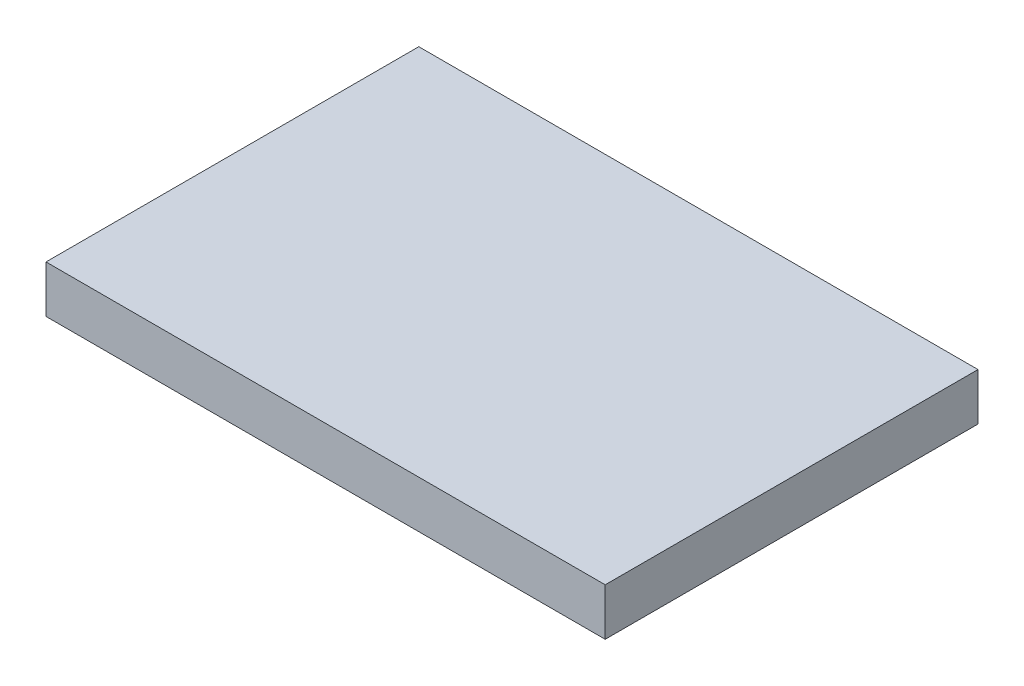
ISO-10303-21;
HEADER;
FILE_DESCRIPTION(('STEP AP214'),'2;1');
FILE_NAME('part.step','',(''),(''),'','','');
FILE_SCHEMA(('AUTOMOTIVE_DESIGN { 1 0 10303 214 1 1 1 1 }'));
ENDSEC;
DATA;
#1=APPLICATION_CONTEXT('core data for automotive mechanical design processes');
#2=APPLICATION_PROTOCOL_DEFINITION('international standard','automotive_design',2000,#1);
#3=PRODUCT_CONTEXT('',#1,'mechanical');
#4=PRODUCT('Part','Part','',(#3));
#5=PRODUCT_RELATED_PRODUCT_CATEGORY('part','',(#4));
#6=PRODUCT_DEFINITION_FORMATION('','',#4);
#7=PRODUCT_DEFINITION_CONTEXT('part definition',#1,'design');
#8=PRODUCT_DEFINITION('design','',#6,#7);
#9=PRODUCT_DEFINITION_SHAPE('','',#8);
#10=(LENGTH_UNIT() NAMED_UNIT(*) SI_UNIT(.MILLI.,.METRE.));
#11=(NAMED_UNIT(*) PLANE_ANGLE_UNIT() SI_UNIT($,.RADIAN.));
#12=(NAMED_UNIT(*) SI_UNIT($,.STERADIAN.) SOLID_ANGLE_UNIT());
#13=UNCERTAINTY_MEASURE_WITH_UNIT(LENGTH_MEASURE(1.E-05),#10,'distance_accuracy_value','');
#14=(GEOMETRIC_REPRESENTATION_CONTEXT(3) GLOBAL_UNCERTAINTY_ASSIGNED_CONTEXT((#13)) GLOBAL_UNIT_ASSIGNED_CONTEXT((#10,
#11,#12)) REPRESENTATION_CONTEXT('',''));
#15=CARTESIAN_POINT('',(0.,0.,0.));
#16=DIRECTION('',(0.,0.,1.));
#17=DIRECTION('',(1.,0.,0.));
#18=AXIS2_PLACEMENT_3D('',#15,#16,#17);
#19=CARTESIAN_POINT('',(-225.,38.,150.));
#20=DIRECTION('',(1.,0.,0.));
#21=DIRECTION('',(0.,0.,-1.));
#22=AXIS2_PLACEMENT_3D('',#19,#20,#21);
#23=PLANE('',#22);
#24=DIRECTION('',(0.,0.,1.));
#25=VECTOR('',#24,1.);
#26=CARTESIAN_POINT('',(-225.,0.,150.));
#27=LINE('',#26,#25);
#28=CARTESIAN_POINT('',(-225.,0.,-150.));
#29=VERTEX_POINT('',#28);
#30=CARTESIAN_POINT('',(-225.,0.,150.));
#31=VERTEX_POINT('',#30);
#32=EDGE_CURVE('E129',#29,#31,#27,.T.);
#33=ORIENTED_EDGE('',*,*,#32,.T.);
#34=DIRECTION('',(0.,-1.,0.));
#35=VECTOR('',#34,1.);
#36=CARTESIAN_POINT('',(-225.,38.,150.));
#37=LINE('',#36,#35);
#38=CARTESIAN_POINT('',(-225.,38.,150.));
#39=VERTEX_POINT('',#38);
#40=EDGE_CURVE('E11',#39,#31,#37,.T.);
#41=ORIENTED_EDGE('',*,*,#40,.F.);
#42=DIRECTION('',(0.,0.,1.));
#43=VECTOR('',#42,1.);
#44=CARTESIAN_POINT('',(-225.,38.,150.));
#45=LINE('',#44,#43);
#46=CARTESIAN_POINT('',(-225.,38.,-150.));
#47=VERTEX_POINT('',#46);
#48=EDGE_CURVE('E149',#47,#39,#45,.T.);
#49=ORIENTED_EDGE('',*,*,#48,.F.);
#50=DIRECTION('',(0.,-1.,0.));
#51=VECTOR('',#50,1.);
#52=CARTESIAN_POINT('',(-225.,38.,-150.));
#53=LINE('',#52,#51);
#54=EDGE_CURVE('E154',#47,#29,#53,.T.);
#55=ORIENTED_EDGE('',*,*,#54,.T.);
#56=EDGE_LOOP('',(#33,#41,#49,#55));
#57=FACE_BOUND('',#56,.T.);
#58=ADVANCED_FACE('F33',(#57),#23,.F.);
#59=CARTESIAN_POINT('',(225.,38.,150.));
#60=DIRECTION('',(0.,0.,-1.));
#61=DIRECTION('',(-1.,0.,0.));
#62=AXIS2_PLACEMENT_3D('',#59,#60,#61);
#63=PLANE('',#62);
#64=DIRECTION('',(1.,0.,0.));
#65=VECTOR('',#64,1.);
#66=CARTESIAN_POINT('',(225.,0.,150.));
#67=LINE('',#66,#65);
#68=CARTESIAN_POINT('',(225.,0.,150.));
#69=VERTEX_POINT('',#68);
#70=EDGE_CURVE('E133',#31,#69,#67,.T.);
#71=ORIENTED_EDGE('',*,*,#70,.T.);
#72=DIRECTION('',(0.,-1.,0.));
#73=VECTOR('',#72,1.);
#74=CARTESIAN_POINT('',(225.,38.,150.));
#75=LINE('',#74,#73);
#76=CARTESIAN_POINT('',(225.,38.,150.));
#77=VERTEX_POINT('',#76);
#78=EDGE_CURVE('E40',#77,#69,#75,.T.);
#79=ORIENTED_EDGE('',*,*,#78,.F.);
#80=DIRECTION('',(1.,0.,0.));
#81=VECTOR('',#80,1.);
#82=CARTESIAN_POINT('',(225.,38.,150.));
#83=LINE('',#82,#81);
#84=EDGE_CURVE('E84',#39,#77,#83,.T.);
#85=ORIENTED_EDGE('',*,*,#84,.F.);
#86=ORIENTED_EDGE('',*,*,#40,.T.);
#87=EDGE_LOOP('',(#71,#79,#85,#86));
#88=FACE_BOUND('',#87,.T.);
#89=ADVANCED_FACE('F183',(#88),#63,.F.);
#90=CARTESIAN_POINT('',(225.,38.,150.));
#91=DIRECTION('',(-1.,0.,0.));
#92=DIRECTION('',(0.,0.,1.));
#93=AXIS2_PLACEMENT_3D('',#90,#91,#92);
#94=PLANE('',#93);
#95=DIRECTION('',(0.,0.,-1.));
#96=VECTOR('',#95,1.);
#97=CARTESIAN_POINT('',(225.,0.,150.));
#98=LINE('',#97,#96);
#99=CARTESIAN_POINT('',(225.,0.,-150.));
#100=VERTEX_POINT('',#99);
#101=EDGE_CURVE('E157',#69,#100,#98,.T.);
#102=ORIENTED_EDGE('',*,*,#101,.T.);
#103=DIRECTION('',(0.,-1.,0.));
#104=VECTOR('',#103,1.);
#105=CARTESIAN_POINT('',(225.,38.,-150.));
#106=LINE('',#105,#104);
#107=CARTESIAN_POINT('',(225.,38.,-150.));
#108=VERTEX_POINT('',#107);
#109=EDGE_CURVE('E161',#108,#100,#106,.T.);
#110=ORIENTED_EDGE('',*,*,#109,.F.);
#111=DIRECTION('',(0.,0.,-1.));
#112=VECTOR('',#111,1.);
#113=CARTESIAN_POINT('',(225.,38.,150.));
#114=LINE('',#113,#112);
#115=EDGE_CURVE('E152',#77,#108,#114,.T.);
#116=ORIENTED_EDGE('',*,*,#115,.F.);
#117=ORIENTED_EDGE('',*,*,#78,.T.);
#118=EDGE_LOOP('',(#102,#110,#116,#117));
#119=FACE_BOUND('',#118,.T.);
#120=ADVANCED_FACE('F166',(#119),#94,.F.);
#121=CARTESIAN_POINT('',(225.,38.,-150.));
#122=DIRECTION('',(0.,0.,1.));
#123=DIRECTION('',(1.,0.,0.));
#124=AXIS2_PLACEMENT_3D('',#121,#122,#123);
#125=PLANE('',#124);
#126=DIRECTION('',(-1.,0.,0.));
#127=VECTOR('',#126,1.);
#128=CARTESIAN_POINT('',(225.,0.,-150.));
#129=LINE('',#128,#127);
#130=EDGE_CURVE('E77',#100,#29,#129,.T.);
#131=ORIENTED_EDGE('',*,*,#130,.T.);
#132=ORIENTED_EDGE('',*,*,#54,.F.);
#133=DIRECTION('',(-1.,0.,0.));
#134=VECTOR('',#133,1.);
#135=CARTESIAN_POINT('',(225.,38.,-150.));
#136=LINE('',#135,#134);
#137=EDGE_CURVE('E56',#108,#47,#136,.T.);
#138=ORIENTED_EDGE('',*,*,#137,.F.);
#139=ORIENTED_EDGE('',*,*,#109,.T.);
#140=EDGE_LOOP('',(#131,#132,#138,#139));
#141=FACE_BOUND('',#140,.T.);
#142=ADVANCED_FACE('F174',(#141),#125,.F.);
#143=CARTESIAN_POINT('',(0.,38.,0.));
#144=DIRECTION('',(0.,1.,0.));
#145=DIRECTION('',(0.,0.,1.));
#146=AXIS2_PLACEMENT_3D('',#143,#144,#145);
#147=PLANE('',#146);
#148=ORIENTED_EDGE('',*,*,#48,.T.);
#149=ORIENTED_EDGE('',*,*,#84,.T.);
#150=ORIENTED_EDGE('',*,*,#115,.T.);
#151=ORIENTED_EDGE('',*,*,#137,.T.);
#152=EDGE_LOOP('',(#148,#149,#150,#151));
#153=FACE_BOUND('',#152,.T.);
#154=ADVANCED_FACE('F176',(#153),#147,.T.);
#155=CARTESIAN_POINT('',(0.,0.,0.));
#156=DIRECTION('',(0.,1.,0.));
#157=DIRECTION('',(0.,0.,1.));
#158=AXIS2_PLACEMENT_3D('',#155,#156,#157);
#159=PLANE('',#158);
#160=DIRECTION('',(-1.,0.,0.));
#161=VECTOR('',#160,1.);
#162=CARTESIAN_POINT('',(225.,0.,-146.));
#163=LINE('',#162,#161);
#164=CARTESIAN_POINT('',(221.,0.,-146.));
#165=VERTEX_POINT('',#164);
#166=CARTESIAN_POINT('',(-221.,0.,-146.));
#167=VERTEX_POINT('',#166);
#168=EDGE_CURVE('E124',#165,#167,#163,.T.);
#169=ORIENTED_EDGE('',*,*,#168,.T.);
#170=DIRECTION('',(0.,0.,1.));
#171=VECTOR('',#170,1.);
#172=CARTESIAN_POINT('',(-221.,0.,150.));
#173=LINE('',#172,#171);
#174=CARTESIAN_POINT('',(-221.,0.,146.));
#175=VERTEX_POINT('',#174);
#176=EDGE_CURVE('E143',#167,#175,#173,.T.);
#177=ORIENTED_EDGE('',*,*,#176,.T.);
#178=DIRECTION('',(1.,0.,0.));
#179=VECTOR('',#178,1.);
#180=CARTESIAN_POINT('',(225.,0.,146.));
#181=LINE('',#180,#179);
#182=CARTESIAN_POINT('',(221.,0.,146.));
#183=VERTEX_POINT('',#182);
#184=EDGE_CURVE('E128',#175,#183,#181,.T.);
#185=ORIENTED_EDGE('',*,*,#184,.T.);
#186=DIRECTION('',(0.,0.,-1.));
#187=VECTOR('',#186,1.);
#188=CARTESIAN_POINT('',(221.,0.,150.));
#189=LINE('',#188,#187);
#190=EDGE_CURVE('E47',#183,#165,#189,.T.);
#191=ORIENTED_EDGE('',*,*,#190,.T.);
#192=EDGE_LOOP('',(#169,#177,#185,#191));
#193=FACE_BOUND('',#192,.T.);
#194=ORIENTED_EDGE('',*,*,#32,.F.);
#195=ORIENTED_EDGE('',*,*,#130,.F.);
#196=ORIENTED_EDGE('',*,*,#101,.F.);
#197=ORIENTED_EDGE('',*,*,#70,.F.);
#198=EDGE_LOOP('',(#194,#195,#196,#197));
#199=FACE_BOUND('',#198,.T.);
#200=ADVANCED_FACE('F170',(#193,#199),#159,.F.);
#201=CARTESIAN_POINT('',(-221.,38.,150.));
#202=DIRECTION('',(1.,0.,0.));
#203=DIRECTION('',(0.,0.,-1.));
#204=AXIS2_PLACEMENT_3D('',#201,#202,#203);
#205=PLANE('',#204);
#206=ORIENTED_EDGE('',*,*,#176,.F.);
#207=DIRECTION('',(0.,-1.,0.));
#208=VECTOR('',#207,1.);
#209=CARTESIAN_POINT('',(-221.,38.,-146.));
#210=LINE('',#209,#208);
#211=CARTESIAN_POINT('',(-221.,34.,-146.));
#212=VERTEX_POINT('',#211);
#213=EDGE_CURVE('E123',#212,#167,#210,.T.);
#214=ORIENTED_EDGE('',*,*,#213,.F.);
#215=DIRECTION('',(0.,0.,1.));
#216=VECTOR('',#215,1.);
#217=CARTESIAN_POINT('',(-221.,34.,150.));
#218=LINE('',#217,#216);
#219=CARTESIAN_POINT('',(-221.,34.,146.));
#220=VERTEX_POINT('',#219);
#221=EDGE_CURVE('E111',#212,#220,#218,.T.);
#222=ORIENTED_EDGE('',*,*,#221,.T.);
#223=DIRECTION('',(0.,-1.,0.));
#224=VECTOR('',#223,1.);
#225=CARTESIAN_POINT('',(-221.,38.,146.));
#226=LINE('',#225,#224);
#227=EDGE_CURVE('E121',#220,#175,#226,.T.);
#228=ORIENTED_EDGE('',*,*,#227,.T.);
#229=EDGE_LOOP('',(#206,#214,#222,#228));
#230=FACE_BOUND('',#229,.T.);
#231=ADVANCED_FACE('F120',(#230),#205,.T.);
#232=CARTESIAN_POINT('',(225.,38.,146.));
#233=DIRECTION('',(0.,0.,-1.));
#234=DIRECTION('',(-1.,0.,0.));
#235=AXIS2_PLACEMENT_3D('',#232,#233,#234);
#236=PLANE('',#235);
#237=ORIENTED_EDGE('',*,*,#184,.F.);
#238=ORIENTED_EDGE('',*,*,#227,.F.);
#239=DIRECTION('',(1.,0.,0.));
#240=VECTOR('',#239,1.);
#241=CARTESIAN_POINT('',(225.,34.,146.));
#242=LINE('',#241,#240);
#243=CARTESIAN_POINT('',(221.,34.,146.));
#244=VERTEX_POINT('',#243);
#245=EDGE_CURVE('E107',#220,#244,#242,.T.);
#246=ORIENTED_EDGE('',*,*,#245,.T.);
#247=DIRECTION('',(0.,-1.,0.));
#248=VECTOR('',#247,1.);
#249=CARTESIAN_POINT('',(221.,38.,146.));
#250=LINE('',#249,#248);
#251=EDGE_CURVE('E130',#244,#183,#250,.T.);
#252=ORIENTED_EDGE('',*,*,#251,.T.);
#253=EDGE_LOOP('',(#237,#238,#246,#252));
#254=FACE_BOUND('',#253,.T.);
#255=ADVANCED_FACE('F126',(#254),#236,.T.);
#256=CARTESIAN_POINT('',(221.,38.,150.));
#257=DIRECTION('',(-1.,0.,0.));
#258=DIRECTION('',(0.,0.,1.));
#259=AXIS2_PLACEMENT_3D('',#256,#257,#258);
#260=PLANE('',#259);
#261=ORIENTED_EDGE('',*,*,#190,.F.);
#262=ORIENTED_EDGE('',*,*,#251,.F.);
#263=DIRECTION('',(0.,0.,-1.));
#264=VECTOR('',#263,1.);
#265=CARTESIAN_POINT('',(221.,34.,150.));
#266=LINE('',#265,#264);
#267=CARTESIAN_POINT('',(221.,34.,-146.));
#268=VERTEX_POINT('',#267);
#269=EDGE_CURVE('E112',#244,#268,#266,.T.);
#270=ORIENTED_EDGE('',*,*,#269,.T.);
#271=DIRECTION('',(0.,-1.,0.));
#272=VECTOR('',#271,1.);
#273=CARTESIAN_POINT('',(221.,38.,-146.));
#274=LINE('',#273,#272);
#275=EDGE_CURVE('E135',#268,#165,#274,.T.);
#276=ORIENTED_EDGE('',*,*,#275,.T.);
#277=EDGE_LOOP('',(#261,#262,#270,#276));
#278=FACE_BOUND('',#277,.T.);
#279=ADVANCED_FACE('F231',(#278),#260,.T.);
#280=CARTESIAN_POINT('',(225.,38.,-146.));
#281=DIRECTION('',(0.,0.,1.));
#282=DIRECTION('',(1.,0.,0.));
#283=AXIS2_PLACEMENT_3D('',#280,#281,#282);
#284=PLANE('',#283);
#285=ORIENTED_EDGE('',*,*,#168,.F.);
#286=ORIENTED_EDGE('',*,*,#275,.F.);
#287=DIRECTION('',(-1.,0.,0.));
#288=VECTOR('',#287,1.);
#289=CARTESIAN_POINT('',(225.,34.,-146.));
#290=LINE('',#289,#288);
#291=EDGE_CURVE('E138',#268,#212,#290,.T.);
#292=ORIENTED_EDGE('',*,*,#291,.T.);
#293=ORIENTED_EDGE('',*,*,#213,.T.);
#294=EDGE_LOOP('',(#285,#286,#292,#293));
#295=FACE_BOUND('',#294,.T.);
#296=ADVANCED_FACE('F240',(#295),#284,.T.);
#297=CARTESIAN_POINT('',(0.,34.,0.));
#298=DIRECTION('',(0.,1.,0.));
#299=DIRECTION('',(0.,0.,1.));
#300=AXIS2_PLACEMENT_3D('',#297,#298,#299);
#301=PLANE('',#300);
#302=ORIENTED_EDGE('',*,*,#221,.F.);
#303=ORIENTED_EDGE('',*,*,#291,.F.);
#304=ORIENTED_EDGE('',*,*,#269,.F.);
#305=ORIENTED_EDGE('',*,*,#245,.F.);
#306=EDGE_LOOP('',(#302,#303,#304,#305));
#307=FACE_BOUND('',#306,.T.);
#308=ADVANCED_FACE('F109',(#307),#301,.F.);
#309=CLOSED_SHELL('',(#58,#89,#120,#142,#154,#200,#231,#255,#279,#296,#308));
#310=MANIFOLD_SOLID_BREP('B2',#309);
#311=ADVANCED_BREP_SHAPE_REPRESENTATION('',(#18,#310),#14);
#312=SHAPE_DEFINITION_REPRESENTATION(#9,#311);
ENDSEC;
END-ISO-10303-21;
